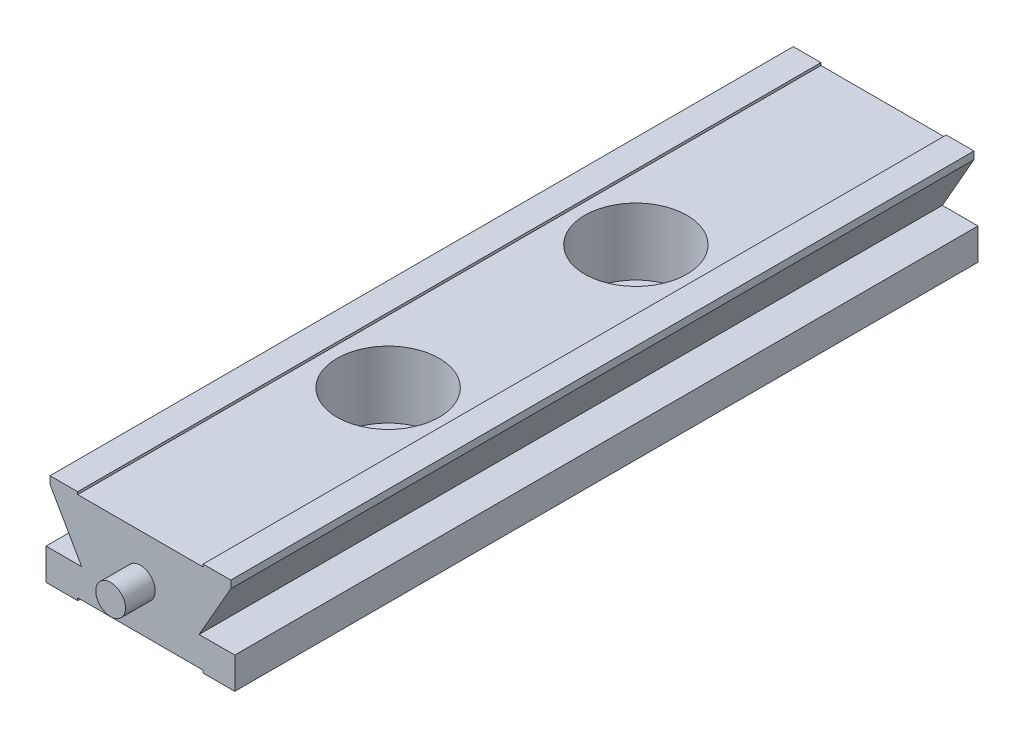
ISO-10303-21;
HEADER;
FILE_DESCRIPTION(('STEP AP214'),'2;1');
FILE_NAME('part.step','',(''),(''),'','','');
FILE_SCHEMA(('AUTOMOTIVE_DESIGN { 1 0 10303 214 1 1 1 1 }'));
ENDSEC;
DATA;
#1=APPLICATION_CONTEXT('core data for automotive mechanical design processes');
#2=APPLICATION_PROTOCOL_DEFINITION('international standard','automotive_design',2000,#1);
#3=PRODUCT_CONTEXT('',#1,'mechanical');
#4=PRODUCT('Part','Part','',(#3));
#5=PRODUCT_RELATED_PRODUCT_CATEGORY('part','',(#4));
#6=PRODUCT_DEFINITION_FORMATION('','',#4);
#7=PRODUCT_DEFINITION_CONTEXT('part definition',#1,'design');
#8=PRODUCT_DEFINITION('design','',#6,#7);
#9=PRODUCT_DEFINITION_SHAPE('','',#8);
#10=(LENGTH_UNIT() NAMED_UNIT(*) SI_UNIT(.MILLI.,.METRE.));
#11=(NAMED_UNIT(*) PLANE_ANGLE_UNIT() SI_UNIT($,.RADIAN.));
#12=(NAMED_UNIT(*) SI_UNIT($,.STERADIAN.) SOLID_ANGLE_UNIT());
#13=UNCERTAINTY_MEASURE_WITH_UNIT(LENGTH_MEASURE(1.E-05),#10,'distance_accuracy_value','');
#14=(GEOMETRIC_REPRESENTATION_CONTEXT(3) GLOBAL_UNCERTAINTY_ASSIGNED_CONTEXT((#13)) GLOBAL_UNIT_ASSIGNED_CONTEXT((#10,
#11,#12)) REPRESENTATION_CONTEXT('',''));
#15=CARTESIAN_POINT('',(0.,0.,0.));
#16=DIRECTION('',(0.,0.,1.));
#17=DIRECTION('',(1.,0.,0.));
#18=AXIS2_PLACEMENT_3D('',#15,#16,#17);
#19=CARTESIAN_POINT('',(-6.3246,9.017,-75.));
#20=DIRECTION('',(0.,1.,0.));
#21=DIRECTION('',(-1.,0.,0.));
#22=AXIS2_PLACEMENT_3D('',#19,#20,#21);
#23=PLANE('',#22);
#24=CARTESIAN_POINT('',(0.,9.01700000000001,-25.));
#25=DIRECTION('',(0.,1.,0.));
#26=DIRECTION('',(-1.,0.,0.));
#27=AXIS2_PLACEMENT_3D('',#24,#25,#26);
#28=CIRCLE('',#27,5.155);
#29=CARTESIAN_POINT('',(-5.155,9.017,-25.));
#30=VERTEX_POINT('',#29);
#31=EDGE_CURVE('E348',#30,#30,#28,.T.);
#32=ORIENTED_EDGE('',*,*,#31,.F.);
#33=EDGE_LOOP('',(#32));
#34=FACE_BOUND('',#33,.T.);
#35=CARTESIAN_POINT('',(0.,9.01700000000001,-50.));
#36=DIRECTION('',(0.,1.,0.));
#37=DIRECTION('',(-1.,0.,0.));
#38=AXIS2_PLACEMENT_3D('',#35,#36,#37);
#39=CIRCLE('',#38,5.155);
#40=CARTESIAN_POINT('',(-5.155,9.017,-50.));
#41=VERTEX_POINT('',#40);
#42=EDGE_CURVE('E352',#41,#41,#39,.T.);
#43=ORIENTED_EDGE('',*,*,#42,.F.);
#44=EDGE_LOOP('',(#43));
#45=FACE_BOUND('',#44,.T.);
#46=DIRECTION('',(-1.,0.,0.));
#47=VECTOR('',#46,1.);
#48=CARTESIAN_POINT('',(-6.3246,9.017,0.));
#49=LINE('',#48,#47);
#50=CARTESIAN_POINT('',(6.32459999999999,9.01700000000001,0.));
#51=VERTEX_POINT('',#50);
#52=CARTESIAN_POINT('',(-6.3246,9.017,0.));
#53=VERTEX_POINT('',#52);
#54=EDGE_CURVE('E205',#51,#53,#49,.T.);
#55=ORIENTED_EDGE('',*,*,#54,.F.);
#56=DIRECTION('',(0.,0.,1.));
#57=VECTOR('',#56,1.);
#58=CARTESIAN_POINT('',(6.32459999999999,9.01700000000001,-75.));
#59=LINE('',#58,#57);
#60=CARTESIAN_POINT('',(6.32459999999999,9.01700000000001,-75.));
#61=VERTEX_POINT('',#60);
#62=EDGE_CURVE('E49',#61,#51,#59,.T.);
#63=ORIENTED_EDGE('',*,*,#62,.F.);
#64=DIRECTION('',(-1.,0.,0.));
#65=VECTOR('',#64,1.);
#66=CARTESIAN_POINT('',(-6.3246,9.017,-75.));
#67=LINE('',#66,#65);
#68=CARTESIAN_POINT('',(-6.3246,9.017,-75.));
#69=VERTEX_POINT('',#68);
#70=EDGE_CURVE('E275',#61,#69,#67,.T.);
#71=ORIENTED_EDGE('',*,*,#70,.T.);
#72=DIRECTION('',(0.,0.,1.));
#73=VECTOR('',#72,1.);
#74=CARTESIAN_POINT('',(-6.3246,9.017,-75.));
#75=LINE('',#74,#73);
#76=EDGE_CURVE('E128',#69,#53,#75,.T.);
#77=ORIENTED_EDGE('',*,*,#76,.T.);
#78=EDGE_LOOP('',(#55,#63,#71,#77));
#79=FACE_BOUND('',#78,.T.);
#80=ADVANCED_FACE('F39',(#34,#45,#79),#23,.T.);
#81=CARTESIAN_POINT('',(6.32459999999999,9.01700000000001,-75.));
#82=DIRECTION('',(-1.,0.,0.));
#83=DIRECTION('',(0.,0.,1.));
#84=AXIS2_PLACEMENT_3D('',#81,#82,#83);
#85=PLANE('',#84);
#86=DIRECTION('',(0.,-1.,0.));
#87=VECTOR('',#86,1.);
#88=CARTESIAN_POINT('',(6.32459999999999,9.01700000000001,0.));
#89=LINE('',#88,#87);
#90=CARTESIAN_POINT('',(6.32459999999999,9.271,0.));
#91=VERTEX_POINT('',#90);
#92=EDGE_CURVE('E271',#91,#51,#89,.T.);
#93=ORIENTED_EDGE('',*,*,#92,.F.);
#94=DIRECTION('',(0.,0.,1.));
#95=VECTOR('',#94,1.);
#96=CARTESIAN_POINT('',(6.32459999999999,9.271,-75.));
#97=LINE('',#96,#95);
#98=CARTESIAN_POINT('',(6.32459999999999,9.271,-75.));
#99=VERTEX_POINT('',#98);
#100=EDGE_CURVE('E116',#99,#91,#97,.T.);
#101=ORIENTED_EDGE('',*,*,#100,.F.);
#102=DIRECTION('',(0.,-1.,0.));
#103=VECTOR('',#102,1.);
#104=CARTESIAN_POINT('',(6.32459999999999,9.01700000000001,-75.));
#105=LINE('',#104,#103);
#106=EDGE_CURVE('E191',#99,#61,#105,.T.);
#107=ORIENTED_EDGE('',*,*,#106,.T.);
#108=ORIENTED_EDGE('',*,*,#62,.T.);
#109=EDGE_LOOP('',(#93,#101,#107,#108));
#110=FACE_BOUND('',#109,.T.);
#111=ADVANCED_FACE('F461',(#110),#85,.T.);
#112=CARTESIAN_POINT('',(6.32459999999999,9.271,-75.));
#113=DIRECTION('',(0.,1.,0.));
#114=DIRECTION('',(-1.,0.,0.));
#115=AXIS2_PLACEMENT_3D('',#112,#113,#114);
#116=PLANE('',#115);
#117=DIRECTION('',(-1.,0.,0.));
#118=VECTOR('',#117,1.);
#119=CARTESIAN_POINT('',(6.32459999999999,9.271,0.));
#120=LINE('',#119,#118);
#121=CARTESIAN_POINT('',(9.1186,9.271,0.));
#122=VERTEX_POINT('',#121);
#123=EDGE_CURVE('E177',#122,#91,#120,.T.);
#124=ORIENTED_EDGE('',*,*,#123,.F.);
#125=DIRECTION('',(0.,0.,1.));
#126=VECTOR('',#125,1.);
#127=CARTESIAN_POINT('',(9.1186,9.271,-75.));
#128=LINE('',#127,#126);
#129=CARTESIAN_POINT('',(9.1186,9.271,-75.));
#130=VERTEX_POINT('',#129);
#131=EDGE_CURVE('E172',#130,#122,#128,.T.);
#132=ORIENTED_EDGE('',*,*,#131,.F.);
#133=DIRECTION('',(-1.,0.,0.));
#134=VECTOR('',#133,1.);
#135=CARTESIAN_POINT('',(6.32459999999999,9.271,-75.));
#136=LINE('',#135,#134);
#137=EDGE_CURVE('E175',#130,#99,#136,.T.);
#138=ORIENTED_EDGE('',*,*,#137,.T.);
#139=ORIENTED_EDGE('',*,*,#100,.T.);
#140=EDGE_LOOP('',(#124,#132,#138,#139));
#141=FACE_BOUND('',#140,.T.);
#142=ADVANCED_FACE('F174',(#141),#116,.T.);
#143=CARTESIAN_POINT('',(9.1186,9.271,-75.));
#144=DIRECTION('',(1.,0.,0.));
#145=DIRECTION('',(0.,0.,-1.));
#146=AXIS2_PLACEMENT_3D('',#143,#144,#145);
#147=PLANE('',#146);
#148=DIRECTION('',(0.,1.,0.));
#149=VECTOR('',#148,1.);
#150=CARTESIAN_POINT('',(9.1186,9.271,0.));
#151=LINE('',#150,#149);
#152=CARTESIAN_POINT('',(9.1186,8.509,0.));
#153=VERTEX_POINT('',#152);
#154=EDGE_CURVE('E266',#153,#122,#151,.T.);
#155=ORIENTED_EDGE('',*,*,#154,.F.);
#156=DIRECTION('',(0.,0.,1.));
#157=VECTOR('',#156,1.);
#158=CARTESIAN_POINT('',(9.1186,8.509,-75.));
#159=LINE('',#158,#157);
#160=CARTESIAN_POINT('',(9.1186,8.509,-75.));
#161=VERTEX_POINT('',#160);
#162=EDGE_CURVE('E183',#161,#153,#159,.T.);
#163=ORIENTED_EDGE('',*,*,#162,.F.);
#164=DIRECTION('',(0.,1.,0.));
#165=VECTOR('',#164,1.);
#166=CARTESIAN_POINT('',(9.1186,9.271,-75.));
#167=LINE('',#166,#165);
#168=EDGE_CURVE('E189',#161,#130,#167,.T.);
#169=ORIENTED_EDGE('',*,*,#168,.T.);
#170=ORIENTED_EDGE('',*,*,#131,.T.);
#171=EDGE_LOOP('',(#155,#163,#169,#170));
#172=FACE_BOUND('',#171,.T.);
#173=ADVANCED_FACE('F194',(#172),#147,.T.);
#174=CARTESIAN_POINT('',(9.1186,8.509,-75.));
#175=DIRECTION('',(0.868289135717219,-0.496058440907365,0.));
#176=DIRECTION('',(0.496058440907365,0.868289135717219,0.));
#177=AXIS2_PLACEMENT_3D('',#174,#175,#176);
#178=PLANE('',#177);
#179=DIRECTION('',(0.496058440907365,0.868289135717219,0.));
#180=VECTOR('',#179,1.);
#181=CARTESIAN_POINT('',(9.1186,8.509,0.));
#182=LINE('',#181,#180);
#183=CARTESIAN_POINT('',(5.92614433775027,2.921,0.));
#184=VERTEX_POINT('',#183);
#185=EDGE_CURVE('E262',#184,#153,#182,.T.);
#186=ORIENTED_EDGE('',*,*,#185,.F.);
#187=DIRECTION('',(0.,0.,1.));
#188=VECTOR('',#187,1.);
#189=CARTESIAN_POINT('',(5.92614433775027,2.921,-75.));
#190=LINE('',#189,#188);
#191=CARTESIAN_POINT('',(5.92614433775027,2.921,-75.));
#192=VERTEX_POINT('',#191);
#193=EDGE_CURVE('E282',#192,#184,#190,.T.);
#194=ORIENTED_EDGE('',*,*,#193,.F.);
#195=DIRECTION('',(0.496058440907365,0.868289135717219,0.));
#196=VECTOR('',#195,1.);
#197=CARTESIAN_POINT('',(9.1186,8.509,-75.));
#198=LINE('',#197,#196);
#199=EDGE_CURVE('E196',#192,#161,#198,.T.);
#200=ORIENTED_EDGE('',*,*,#199,.T.);
#201=ORIENTED_EDGE('',*,*,#162,.T.);
#202=EDGE_LOOP('',(#186,#194,#200,#201));
#203=FACE_BOUND('',#202,.T.);
#204=ADVANCED_FACE('F475',(#203),#178,.T.);
#205=CARTESIAN_POINT('',(5.92614433775027,2.921,-75.));
#206=DIRECTION('',(0.,1.,0.));
#207=DIRECTION('',(0.,0.,1.));
#208=AXIS2_PLACEMENT_3D('',#205,#206,#207);
#209=PLANE('',#208);
#210=DIRECTION('',(-1.,0.,0.));
#211=VECTOR('',#210,1.);
#212=CARTESIAN_POINT('',(5.92614433775027,2.921,0.));
#213=LINE('',#212,#211);
#214=CARTESIAN_POINT('',(9.525,2.921,0.));
#215=VERTEX_POINT('',#214);
#216=EDGE_CURVE('E258',#215,#184,#213,.T.);
#217=ORIENTED_EDGE('',*,*,#216,.F.);
#218=DIRECTION('',(0.,0.,1.));
#219=VECTOR('',#218,1.);
#220=CARTESIAN_POINT('',(9.525,2.921,-75.));
#221=LINE('',#220,#219);
#222=CARTESIAN_POINT('',(9.525,2.921,-75.));
#223=VERTEX_POINT('',#222);
#224=EDGE_CURVE('E285',#223,#215,#221,.T.);
#225=ORIENTED_EDGE('',*,*,#224,.F.);
#226=DIRECTION('',(-1.,0.,0.));
#227=VECTOR('',#226,1.);
#228=CARTESIAN_POINT('',(5.92614433775027,2.921,-75.));
#229=LINE('',#228,#227);
#230=EDGE_CURVE('E199',#223,#192,#229,.T.);
#231=ORIENTED_EDGE('',*,*,#230,.T.);
#232=ORIENTED_EDGE('',*,*,#193,.T.);
#233=EDGE_LOOP('',(#217,#225,#231,#232));
#234=FACE_BOUND('',#233,.T.);
#235=ADVANCED_FACE('F412',(#234),#209,.T.);
#236=CARTESIAN_POINT('',(9.525,2.921,-75.));
#237=DIRECTION('',(1.,0.,0.));
#238=DIRECTION('',(0.,0.,-1.));
#239=AXIS2_PLACEMENT_3D('',#236,#237,#238);
#240=PLANE('',#239);
#241=DIRECTION('',(0.,1.,0.));
#242=VECTOR('',#241,1.);
#243=CARTESIAN_POINT('',(9.525,2.921,0.));
#244=LINE('',#243,#242);
#245=CARTESIAN_POINT('',(9.525,-0.253999999999995,0.));
#246=VERTEX_POINT('',#245);
#247=EDGE_CURVE('E254',#246,#215,#244,.T.);
#248=ORIENTED_EDGE('',*,*,#247,.F.);
#249=DIRECTION('',(0.,0.,1.));
#250=VECTOR('',#249,1.);
#251=CARTESIAN_POINT('',(9.525,-0.253999999999995,-75.));
#252=LINE('',#251,#250);
#253=CARTESIAN_POINT('',(9.525,-0.253999999999995,-75.));
#254=VERTEX_POINT('',#253);
#255=EDGE_CURVE('E288',#254,#246,#252,.T.);
#256=ORIENTED_EDGE('',*,*,#255,.F.);
#257=DIRECTION('',(0.,1.,0.));
#258=VECTOR('',#257,1.);
#259=CARTESIAN_POINT('',(9.525,2.921,-75.));
#260=LINE('',#259,#258);
#261=EDGE_CURVE('E404',#254,#223,#260,.T.);
#262=ORIENTED_EDGE('',*,*,#261,.T.);
#263=ORIENTED_EDGE('',*,*,#224,.T.);
#264=EDGE_LOOP('',(#248,#256,#262,#263));
#265=FACE_BOUND('',#264,.T.);
#266=ADVANCED_FACE('F418',(#265),#240,.T.);
#267=CARTESIAN_POINT('',(9.525,-0.253999999999995,-75.));
#268=DIRECTION('',(0.,-1.,0.));
#269=DIRECTION('',(1.,0.,0.));
#270=AXIS2_PLACEMENT_3D('',#267,#268,#269);
#271=PLANE('',#270);
#272=DIRECTION('',(1.,0.,0.));
#273=VECTOR('',#272,1.);
#274=CARTESIAN_POINT('',(9.525,-0.253999999999995,0.));
#275=LINE('',#274,#273);
#276=CARTESIAN_POINT('',(6.3246,-0.253999999999993,0.));
#277=VERTEX_POINT('',#276);
#278=EDGE_CURVE('E250',#277,#246,#275,.T.);
#279=ORIENTED_EDGE('',*,*,#278,.F.);
#280=DIRECTION('',(0.,0.,1.));
#281=VECTOR('',#280,1.);
#282=CARTESIAN_POINT('',(6.3246,-0.253999999999993,-75.));
#283=LINE('',#282,#281);
#284=CARTESIAN_POINT('',(6.3246,-0.253999999999993,-75.));
#285=VERTEX_POINT('',#284);
#286=EDGE_CURVE('E291',#285,#277,#283,.T.);
#287=ORIENTED_EDGE('',*,*,#286,.F.);
#288=DIRECTION('',(1.,0.,0.));
#289=VECTOR('',#288,1.);
#290=CARTESIAN_POINT('',(9.525,-0.253999999999995,-75.));
#291=LINE('',#290,#289);
#292=EDGE_CURVE('E400',#285,#254,#291,.T.);
#293=ORIENTED_EDGE('',*,*,#292,.T.);
#294=ORIENTED_EDGE('',*,*,#255,.T.);
#295=EDGE_LOOP('',(#279,#287,#293,#294));
#296=FACE_BOUND('',#295,.T.);
#297=ADVANCED_FACE('F421',(#296),#271,.T.);
#298=CARTESIAN_POINT('',(6.3246,-0.253999999999993,-75.));
#299=DIRECTION('',(-1.,0.,0.));
#300=DIRECTION('',(0.,0.,1.));
#301=AXIS2_PLACEMENT_3D('',#298,#299,#300);
#302=PLANE('',#301);
#303=DIRECTION('',(0.,-1.,0.));
#304=VECTOR('',#303,1.);
#305=CARTESIAN_POINT('',(6.3246,-0.253999999999993,0.));
#306=LINE('',#305,#304);
#307=CARTESIAN_POINT('',(6.3246,0.,0.));
#308=VERTEX_POINT('',#307);
#309=EDGE_CURVE('E246',#308,#277,#306,.T.);
#310=ORIENTED_EDGE('',*,*,#309,.F.);
#311=DIRECTION('',(0.,0.,1.));
#312=VECTOR('',#311,1.);
#313=CARTESIAN_POINT('',(6.3246,0.,-75.));
#314=LINE('',#313,#312);
#315=CARTESIAN_POINT('',(6.3246,0.,-75.));
#316=VERTEX_POINT('',#315);
#317=EDGE_CURVE('E294',#316,#308,#314,.T.);
#318=ORIENTED_EDGE('',*,*,#317,.F.);
#319=DIRECTION('',(0.,-1.,0.));
#320=VECTOR('',#319,1.);
#321=CARTESIAN_POINT('',(6.3246,-0.253999999999993,-75.));
#322=LINE('',#321,#320);
#323=EDGE_CURVE('E396',#316,#285,#322,.T.);
#324=ORIENTED_EDGE('',*,*,#323,.T.);
#325=ORIENTED_EDGE('',*,*,#286,.T.);
#326=EDGE_LOOP('',(#310,#318,#324,#325));
#327=FACE_BOUND('',#326,.T.);
#328=ADVANCED_FACE('F426',(#327),#302,.T.);
#329=CARTESIAN_POINT('',(6.3246,0.,-75.));
#330=DIRECTION('',(0.,-1.,0.));
#331=DIRECTION('',(1.,0.,0.));
#332=AXIS2_PLACEMENT_3D('',#329,#330,#331);
#333=PLANE('',#332);
#334=CARTESIAN_POINT('',(0.,0.,-50.));
#335=DIRECTION('',(0.,-1.,0.));
#336=DIRECTION('',(1.,0.,0.));
#337=AXIS2_PLACEMENT_3D('',#334,#335,#336);
#338=CIRCLE('',#337,3.365);
#339=CARTESIAN_POINT('',(3.365,0.,-50.));
#340=VERTEX_POINT('',#339);
#341=EDGE_CURVE('E325',#340,#340,#338,.T.);
#342=ORIENTED_EDGE('',*,*,#341,.F.);
#343=EDGE_LOOP('',(#342));
#344=FACE_BOUND('',#343,.T.);
#345=CARTESIAN_POINT('',(0.,0.,-25.));
#346=DIRECTION('',(0.,-1.,0.));
#347=DIRECTION('',(1.,0.,0.));
#348=AXIS2_PLACEMENT_3D('',#345,#346,#347);
#349=CIRCLE('',#348,3.365);
#350=CARTESIAN_POINT('',(3.365,0.,-25.));
#351=VERTEX_POINT('',#350);
#352=EDGE_CURVE('E333',#351,#351,#349,.T.);
#353=ORIENTED_EDGE('',*,*,#352,.F.);
#354=EDGE_LOOP('',(#353));
#355=FACE_BOUND('',#354,.T.);
#356=DIRECTION('',(1.,0.,0.));
#357=VECTOR('',#356,1.);
#358=CARTESIAN_POINT('',(6.3246,0.,0.));
#359=LINE('',#358,#357);
#360=CARTESIAN_POINT('',(-6.3246,0.,0.));
#361=VERTEX_POINT('',#360);
#362=EDGE_CURVE('E242',#361,#308,#359,.T.);
#363=ORIENTED_EDGE('',*,*,#362,.F.);
#364=DIRECTION('',(0.,0.,1.));
#365=VECTOR('',#364,1.);
#366=CARTESIAN_POINT('',(-6.3246,0.,-75.));
#367=LINE('',#366,#365);
#368=CARTESIAN_POINT('',(-6.3246,0.,-75.));
#369=VERTEX_POINT('',#368);
#370=EDGE_CURVE('E297',#369,#361,#367,.T.);
#371=ORIENTED_EDGE('',*,*,#370,.F.);
#372=DIRECTION('',(1.,0.,0.));
#373=VECTOR('',#372,1.);
#374=CARTESIAN_POINT('',(6.3246,0.,-75.));
#375=LINE('',#374,#373);
#376=EDGE_CURVE('E392',#369,#316,#375,.T.);
#377=ORIENTED_EDGE('',*,*,#376,.T.);
#378=ORIENTED_EDGE('',*,*,#317,.T.);
#379=EDGE_LOOP('',(#363,#371,#377,#378));
#380=FACE_BOUND('',#379,.T.);
#381=ADVANCED_FACE('F429',(#344,#355,#380),#333,.T.);
#382=CARTESIAN_POINT('',(-6.3246,0.,-75.));
#383=DIRECTION('',(1.,0.,0.));
#384=DIRECTION('',(0.,0.,-1.));
#385=AXIS2_PLACEMENT_3D('',#382,#383,#384);
#386=PLANE('',#385);
#387=DIRECTION('',(0.,1.,0.));
#388=VECTOR('',#387,1.);
#389=CARTESIAN_POINT('',(-6.3246,0.,0.));
#390=LINE('',#389,#388);
#391=CARTESIAN_POINT('',(-6.3246,-0.253999999999997,0.));
#392=VERTEX_POINT('',#391);
#393=EDGE_CURVE('E238',#392,#361,#390,.T.);
#394=ORIENTED_EDGE('',*,*,#393,.F.);
#395=DIRECTION('',(0.,0.,1.));
#396=VECTOR('',#395,1.);
#397=CARTESIAN_POINT('',(-6.3246,-0.253999999999997,-75.));
#398=LINE('',#397,#396);
#399=CARTESIAN_POINT('',(-6.3246,-0.253999999999997,-75.));
#400=VERTEX_POINT('',#399);
#401=EDGE_CURVE('E300',#400,#392,#398,.T.);
#402=ORIENTED_EDGE('',*,*,#401,.F.);
#403=DIRECTION('',(0.,1.,0.));
#404=VECTOR('',#403,1.);
#405=CARTESIAN_POINT('',(-6.3246,0.,-75.));
#406=LINE('',#405,#404);
#407=EDGE_CURVE('E388',#400,#369,#406,.T.);
#408=ORIENTED_EDGE('',*,*,#407,.T.);
#409=ORIENTED_EDGE('',*,*,#370,.T.);
#410=EDGE_LOOP('',(#394,#402,#408,#409));
#411=FACE_BOUND('',#410,.T.);
#412=ADVANCED_FACE('F434',(#411),#386,.T.);
#413=CARTESIAN_POINT('',(-6.3246,-0.253999999999997,-75.));
#414=DIRECTION('',(0.,-1.,0.));
#415=DIRECTION('',(1.,0.,0.));
#416=AXIS2_PLACEMENT_3D('',#413,#414,#415);
#417=PLANE('',#416);
#418=DIRECTION('',(1.,0.,0.));
#419=VECTOR('',#418,1.);
#420=CARTESIAN_POINT('',(-6.3246,-0.253999999999997,0.));
#421=LINE('',#420,#419);
#422=CARTESIAN_POINT('',(-9.525,-0.253999999999997,0.));
#423=VERTEX_POINT('',#422);
#424=EDGE_CURVE('E234',#423,#392,#421,.T.);
#425=ORIENTED_EDGE('',*,*,#424,.F.);
#426=DIRECTION('',(0.,0.,1.));
#427=VECTOR('',#426,1.);
#428=CARTESIAN_POINT('',(-9.525,-0.253999999999997,-75.));
#429=LINE('',#428,#427);
#430=CARTESIAN_POINT('',(-9.525,-0.253999999999997,-75.));
#431=VERTEX_POINT('',#430);
#432=EDGE_CURVE('E303',#431,#423,#429,.T.);
#433=ORIENTED_EDGE('',*,*,#432,.F.);
#434=DIRECTION('',(1.,0.,0.));
#435=VECTOR('',#434,1.);
#436=CARTESIAN_POINT('',(-6.3246,-0.253999999999997,-75.));
#437=LINE('',#436,#435);
#438=EDGE_CURVE('E384',#431,#400,#437,.T.);
#439=ORIENTED_EDGE('',*,*,#438,.T.);
#440=ORIENTED_EDGE('',*,*,#401,.T.);
#441=EDGE_LOOP('',(#425,#433,#439,#440));
#442=FACE_BOUND('',#441,.T.);
#443=ADVANCED_FACE('F437',(#442),#417,.T.);
#444=CARTESIAN_POINT('',(-9.525,-0.253999999999997,-75.));
#445=DIRECTION('',(-1.,0.,0.));
#446=DIRECTION('',(0.,0.,1.));
#447=AXIS2_PLACEMENT_3D('',#444,#445,#446);
#448=PLANE('',#447);
#449=DIRECTION('',(0.,-1.,0.));
#450=VECTOR('',#449,1.);
#451=CARTESIAN_POINT('',(-9.525,-0.253999999999997,0.));
#452=LINE('',#451,#450);
#453=CARTESIAN_POINT('',(-9.525,2.921,0.));
#454=VERTEX_POINT('',#453);
#455=EDGE_CURVE('E230',#454,#423,#452,.T.);
#456=ORIENTED_EDGE('',*,*,#455,.F.);
#457=DIRECTION('',(0.,0.,1.));
#458=VECTOR('',#457,1.);
#459=CARTESIAN_POINT('',(-9.525,2.921,-75.));
#460=LINE('',#459,#458);
#461=CARTESIAN_POINT('',(-9.525,2.921,-75.));
#462=VERTEX_POINT('',#461);
#463=EDGE_CURVE('E306',#462,#454,#460,.T.);
#464=ORIENTED_EDGE('',*,*,#463,.F.);
#465=DIRECTION('',(0.,-1.,0.));
#466=VECTOR('',#465,1.);
#467=CARTESIAN_POINT('',(-9.525,-0.253999999999997,-75.));
#468=LINE('',#467,#466);
#469=EDGE_CURVE('E380',#462,#431,#468,.T.);
#470=ORIENTED_EDGE('',*,*,#469,.T.);
#471=ORIENTED_EDGE('',*,*,#432,.T.);
#472=EDGE_LOOP('',(#456,#464,#470,#471));
#473=FACE_BOUND('',#472,.T.);
#474=ADVANCED_FACE('F442',(#473),#448,.T.);
#475=CARTESIAN_POINT('',(-9.525,2.921,-75.));
#476=DIRECTION('',(0.,1.,0.));
#477=DIRECTION('',(0.,0.,1.));
#478=AXIS2_PLACEMENT_3D('',#475,#476,#477);
#479=PLANE('',#478);
#480=DIRECTION('',(-1.,0.,0.));
#481=VECTOR('',#480,1.);
#482=CARTESIAN_POINT('',(-9.525,2.921,0.));
#483=LINE('',#482,#481);
#484=CARTESIAN_POINT('',(-5.92614433775027,2.921,0.));
#485=VERTEX_POINT('',#484);
#486=EDGE_CURVE('E226',#485,#454,#483,.T.);
#487=ORIENTED_EDGE('',*,*,#486,.F.);
#488=DIRECTION('',(0.,0.,1.));
#489=VECTOR('',#488,1.);
#490=CARTESIAN_POINT('',(-5.92614433775027,2.921,-75.));
#491=LINE('',#490,#489);
#492=CARTESIAN_POINT('',(-5.92614433775027,2.921,-75.));
#493=VERTEX_POINT('',#492);
#494=EDGE_CURVE('E309',#493,#485,#491,.T.);
#495=ORIENTED_EDGE('',*,*,#494,.F.);
#496=DIRECTION('',(-1.,0.,0.));
#497=VECTOR('',#496,1.);
#498=CARTESIAN_POINT('',(-9.525,2.921,-75.));
#499=LINE('',#498,#497);
#500=EDGE_CURVE('E376',#493,#462,#499,.T.);
#501=ORIENTED_EDGE('',*,*,#500,.T.);
#502=ORIENTED_EDGE('',*,*,#463,.T.);
#503=EDGE_LOOP('',(#487,#495,#501,#502));
#504=FACE_BOUND('',#503,.T.);
#505=ADVANCED_FACE('F445',(#504),#479,.T.);
#506=CARTESIAN_POINT('',(-5.92614433775027,2.921,-75.));
#507=DIRECTION('',(-0.868289135717219,-0.496058440907365,0.));
#508=DIRECTION('',(0.496058440907365,-0.868289135717219,0.));
#509=AXIS2_PLACEMENT_3D('',#506,#507,#508);
#510=PLANE('',#509);
#511=DIRECTION('',(0.496058440907365,-0.868289135717219,0.));
#512=VECTOR('',#511,1.);
#513=CARTESIAN_POINT('',(-5.92614433775027,2.921,0.));
#514=LINE('',#513,#512);
#515=CARTESIAN_POINT('',(-9.1186,8.509,0.));
#516=VERTEX_POINT('',#515);
#517=EDGE_CURVE('E222',#516,#485,#514,.T.);
#518=ORIENTED_EDGE('',*,*,#517,.F.);
#519=DIRECTION('',(0.,0.,1.));
#520=VECTOR('',#519,1.);
#521=CARTESIAN_POINT('',(-9.1186,8.509,-75.));
#522=LINE('',#521,#520);
#523=CARTESIAN_POINT('',(-9.1186,8.509,-75.));
#524=VERTEX_POINT('',#523);
#525=EDGE_CURVE('E312',#524,#516,#522,.T.);
#526=ORIENTED_EDGE('',*,*,#525,.F.);
#527=DIRECTION('',(0.496058440907365,-0.868289135717219,0.));
#528=VECTOR('',#527,1.);
#529=CARTESIAN_POINT('',(-5.92614433775027,2.921,-75.));
#530=LINE('',#529,#528);
#531=EDGE_CURVE('E372',#524,#493,#530,.T.);
#532=ORIENTED_EDGE('',*,*,#531,.T.);
#533=ORIENTED_EDGE('',*,*,#494,.T.);
#534=EDGE_LOOP('',(#518,#526,#532,#533));
#535=FACE_BOUND('',#534,.T.);
#536=ADVANCED_FACE('F450',(#535),#510,.T.);
#537=CARTESIAN_POINT('',(-9.1186,8.509,-75.));
#538=DIRECTION('',(-1.,0.,0.));
#539=DIRECTION('',(0.,0.,1.));
#540=AXIS2_PLACEMENT_3D('',#537,#538,#539);
#541=PLANE('',#540);
#542=DIRECTION('',(0.,-1.,0.));
#543=VECTOR('',#542,1.);
#544=CARTESIAN_POINT('',(-9.1186,8.509,0.));
#545=LINE('',#544,#543);
#546=CARTESIAN_POINT('',(-9.1186,9.271,0.));
#547=VERTEX_POINT('',#546);
#548=EDGE_CURVE('E218',#547,#516,#545,.T.);
#549=ORIENTED_EDGE('',*,*,#548,.F.);
#550=DIRECTION('',(0.,0.,1.));
#551=VECTOR('',#550,1.);
#552=CARTESIAN_POINT('',(-9.1186,9.271,-75.));
#553=LINE('',#552,#551);
#554=CARTESIAN_POINT('',(-9.1186,9.271,-75.));
#555=VERTEX_POINT('',#554);
#556=EDGE_CURVE('E315',#555,#547,#553,.T.);
#557=ORIENTED_EDGE('',*,*,#556,.F.);
#558=DIRECTION('',(0.,-1.,0.));
#559=VECTOR('',#558,1.);
#560=CARTESIAN_POINT('',(-9.1186,8.509,-75.));
#561=LINE('',#560,#559);
#562=EDGE_CURVE('E368',#555,#524,#561,.T.);
#563=ORIENTED_EDGE('',*,*,#562,.T.);
#564=ORIENTED_EDGE('',*,*,#525,.T.);
#565=EDGE_LOOP('',(#549,#557,#563,#564));
#566=FACE_BOUND('',#565,.T.);
#567=ADVANCED_FACE('F453',(#566),#541,.T.);
#568=CARTESIAN_POINT('',(-9.1186,9.271,-75.));
#569=DIRECTION('',(0.,1.,0.));
#570=DIRECTION('',(0.,0.,1.));
#571=AXIS2_PLACEMENT_3D('',#568,#569,#570);
#572=PLANE('',#571);
#573=DIRECTION('',(-1.,0.,0.));
#574=VECTOR('',#573,1.);
#575=CARTESIAN_POINT('',(-9.1186,9.271,0.));
#576=LINE('',#575,#574);
#577=CARTESIAN_POINT('',(-6.3246,9.271,0.));
#578=VERTEX_POINT('',#577);
#579=EDGE_CURVE('E214',#578,#547,#576,.T.);
#580=ORIENTED_EDGE('',*,*,#579,.F.);
#581=DIRECTION('',(0.,0.,1.));
#582=VECTOR('',#581,1.);
#583=CARTESIAN_POINT('',(-6.3246,9.271,-75.));
#584=LINE('',#583,#582);
#585=CARTESIAN_POINT('',(-6.3246,9.271,-75.));
#586=VERTEX_POINT('',#585);
#587=EDGE_CURVE('E318',#586,#578,#584,.T.);
#588=ORIENTED_EDGE('',*,*,#587,.F.);
#589=DIRECTION('',(-1.,0.,0.));
#590=VECTOR('',#589,1.);
#591=CARTESIAN_POINT('',(-9.1186,9.271,-75.));
#592=LINE('',#591,#590);
#593=EDGE_CURVE('E364',#586,#555,#592,.T.);
#594=ORIENTED_EDGE('',*,*,#593,.T.);
#595=ORIENTED_EDGE('',*,*,#556,.T.);
#596=EDGE_LOOP('',(#580,#588,#594,#595));
#597=FACE_BOUND('',#596,.T.);
#598=ADVANCED_FACE('F457',(#597),#572,.T.);
#599=CARTESIAN_POINT('',(-6.3246,9.271,-75.));
#600=DIRECTION('',(1.,0.,0.));
#601=DIRECTION('',(0.,0.,-1.));
#602=AXIS2_PLACEMENT_3D('',#599,#600,#601);
#603=PLANE('',#602);
#604=DIRECTION('',(0.,1.,0.));
#605=VECTOR('',#604,1.);
#606=CARTESIAN_POINT('',(-6.3246,9.271,0.));
#607=LINE('',#606,#605);
#608=EDGE_CURVE('E209',#53,#578,#607,.T.);
#609=ORIENTED_EDGE('',*,*,#608,.F.);
#610=ORIENTED_EDGE('',*,*,#76,.F.);
#611=DIRECTION('',(0.,1.,0.));
#612=VECTOR('',#611,1.);
#613=CARTESIAN_POINT('',(-6.3246,9.271,-75.));
#614=LINE('',#613,#612);
#615=EDGE_CURVE('E361',#69,#586,#614,.T.);
#616=ORIENTED_EDGE('',*,*,#615,.T.);
#617=ORIENTED_EDGE('',*,*,#587,.T.);
#618=EDGE_LOOP('',(#609,#610,#616,#617));
#619=FACE_BOUND('',#618,.T.);
#620=ADVANCED_FACE('F458',(#619),#603,.T.);
#621=CARTESIAN_POINT('',(0.,0.,-75.));
#622=DIRECTION('',(0.,0.,1.));
#623=DIRECTION('',(1.,0.,0.));
#624=AXIS2_PLACEMENT_3D('',#621,#622,#623);
#625=PLANE('',#624);
#626=CARTESIAN_POINT('',(0.,4.5085,-75.));
#627=DIRECTION('',(0.,0.,-1.));
#628=DIRECTION('',(-1.,0.,0.));
#629=AXIS2_PLACEMENT_3D('',#626,#627,#628);
#630=CIRCLE('',#629,1.5);
#631=CARTESIAN_POINT('',(-1.5,4.5085,-75.));
#632=VERTEX_POINT('',#631);
#633=EDGE_CURVE('E342',#632,#632,#630,.T.);
#634=ORIENTED_EDGE('',*,*,#633,.F.);
#635=EDGE_LOOP('',(#634));
#636=FACE_BOUND('',#635,.T.);
#637=ORIENTED_EDGE('',*,*,#70,.F.);
#638=ORIENTED_EDGE('',*,*,#106,.F.);
#639=ORIENTED_EDGE('',*,*,#137,.F.);
#640=ORIENTED_EDGE('',*,*,#168,.F.);
#641=ORIENTED_EDGE('',*,*,#199,.F.);
#642=ORIENTED_EDGE('',*,*,#230,.F.);
#643=ORIENTED_EDGE('',*,*,#261,.F.);
#644=ORIENTED_EDGE('',*,*,#292,.F.);
#645=ORIENTED_EDGE('',*,*,#323,.F.);
#646=ORIENTED_EDGE('',*,*,#376,.F.);
#647=ORIENTED_EDGE('',*,*,#407,.F.);
#648=ORIENTED_EDGE('',*,*,#438,.F.);
#649=ORIENTED_EDGE('',*,*,#469,.F.);
#650=ORIENTED_EDGE('',*,*,#500,.F.);
#651=ORIENTED_EDGE('',*,*,#531,.F.);
#652=ORIENTED_EDGE('',*,*,#562,.F.);
#653=ORIENTED_EDGE('',*,*,#593,.F.);
#654=ORIENTED_EDGE('',*,*,#615,.F.);
#655=EDGE_LOOP('',(#637,#638,#639,#640,#641,#642,#643,#644,#645,#646,#647,#648,#649,#650,#651,
#652,#653,#654));
#656=FACE_BOUND('',#655,.T.);
#657=ADVANCED_FACE('F187',(#636,#656),#625,.F.);
#658=CARTESIAN_POINT('',(0.,0.,0.));
#659=DIRECTION('',(0.,0.,1.));
#660=DIRECTION('',(1.,0.,0.));
#661=AXIS2_PLACEMENT_3D('',#658,#659,#660);
#662=PLANE('',#661);
#663=CARTESIAN_POINT('',(0.,4.5085,0.));
#664=DIRECTION('',(0.,0.,1.));
#665=DIRECTION('',(1.,0.,0.));
#666=AXIS2_PLACEMENT_3D('',#663,#664,#665);
#667=CIRCLE('',#666,1.5);
#668=CARTESIAN_POINT('',(1.5,4.5085,0.));
#669=VERTEX_POINT('',#668);
#670=EDGE_CURVE('E11',#669,#669,#667,.T.);
#671=ORIENTED_EDGE('',*,*,#670,.F.);
#672=EDGE_LOOP('',(#671));
#673=FACE_BOUND('',#672,.T.);
#674=ORIENTED_EDGE('',*,*,#54,.T.);
#675=ORIENTED_EDGE('',*,*,#608,.T.);
#676=ORIENTED_EDGE('',*,*,#579,.T.);
#677=ORIENTED_EDGE('',*,*,#548,.T.);
#678=ORIENTED_EDGE('',*,*,#517,.T.);
#679=ORIENTED_EDGE('',*,*,#486,.T.);
#680=ORIENTED_EDGE('',*,*,#455,.T.);
#681=ORIENTED_EDGE('',*,*,#424,.T.);
#682=ORIENTED_EDGE('',*,*,#393,.T.);
#683=ORIENTED_EDGE('',*,*,#362,.T.);
#684=ORIENTED_EDGE('',*,*,#309,.T.);
#685=ORIENTED_EDGE('',*,*,#278,.T.);
#686=ORIENTED_EDGE('',*,*,#247,.T.);
#687=ORIENTED_EDGE('',*,*,#216,.T.);
#688=ORIENTED_EDGE('',*,*,#185,.T.);
#689=ORIENTED_EDGE('',*,*,#154,.T.);
#690=ORIENTED_EDGE('',*,*,#123,.T.);
#691=ORIENTED_EDGE('',*,*,#92,.T.);
#692=EDGE_LOOP('',(#674,#675,#676,#677,#678,#679,#680,#681,#682,#683,#684,#685,#686,#687,#688,
#689,#690,#691));
#693=FACE_BOUND('',#692,.T.);
#694=ADVANCED_FACE('F460',(#673,#693),#662,.T.);
#695=CARTESIAN_POINT('',(0.,2.28700000000001,-50.));
#696=DIRECTION('',(0.,1.,0.));
#697=DIRECTION('',(-1.,0.,0.));
#698=AXIS2_PLACEMENT_3D('',#695,#696,#697);
#699=CYLINDRICAL_SURFACE('',#698,5.155);
#700=CARTESIAN_POINT('',(0.,2.28700000000001,-50.));
#701=DIRECTION('',(0.,1.,0.));
#702=DIRECTION('',(-1.,0.,0.));
#703=AXIS2_PLACEMENT_3D('',#700,#701,#702);
#704=CIRCLE('',#703,5.155);
#705=CARTESIAN_POINT('',(-5.155,2.287,-50.));
#706=VERTEX_POINT('',#705);
#707=EDGE_CURVE('E331',#706,#706,#704,.T.);
#708=ORIENTED_EDGE('',*,*,#707,.F.);
#709=EDGE_LOOP('',(#708));
#710=FACE_BOUND('',#709,.T.);
#711=ORIENTED_EDGE('',*,*,#42,.T.);
#712=EDGE_LOOP('',(#711));
#713=FACE_BOUND('',#712,.T.);
#714=ADVANCED_FACE('F511',(#710,#713),#699,.F.);
#715=CARTESIAN_POINT('',(0.,2.28700000000001,-50.));
#716=DIRECTION('',(0.,1.,0.));
#717=DIRECTION('',(-1.,0.,0.));
#718=AXIS2_PLACEMENT_3D('',#715,#716,#717);
#719=PLANE('',#718);
#720=CARTESIAN_POINT('',(0.,2.28700000000001,-50.));
#721=DIRECTION('',(0.,1.,0.));
#722=DIRECTION('',(-1.,0.,0.));
#723=AXIS2_PLACEMENT_3D('',#720,#721,#722);
#724=CIRCLE('',#723,3.365);
#725=CARTESIAN_POINT('',(-3.365,2.287,-50.));
#726=VERTEX_POINT('',#725);
#727=EDGE_CURVE('E42',#726,#726,#724,.T.);
#728=ORIENTED_EDGE('',*,*,#727,.F.);
#729=EDGE_LOOP('',(#728));
#730=FACE_BOUND('',#729,.T.);
#731=ORIENTED_EDGE('',*,*,#707,.T.);
#732=EDGE_LOOP('',(#731));
#733=FACE_BOUND('',#732,.T.);
#734=ADVANCED_FACE('F515',(#730,#733),#719,.T.);
#735=CARTESIAN_POINT('',(0.,2.28700000000001,-25.));
#736=DIRECTION('',(0.,1.,0.));
#737=DIRECTION('',(-1.,0.,0.));
#738=AXIS2_PLACEMENT_3D('',#735,#736,#737);
#739=CYLINDRICAL_SURFACE('',#738,5.155);
#740=CARTESIAN_POINT('',(0.,2.28700000000001,-25.));
#741=DIRECTION('',(0.,1.,0.));
#742=DIRECTION('',(-1.,0.,0.));
#743=AXIS2_PLACEMENT_3D('',#740,#741,#742);
#744=CIRCLE('',#743,5.155);
#745=CARTESIAN_POINT('',(-5.15499999999999,2.287,-25.));
#746=VERTEX_POINT('',#745);
#747=EDGE_CURVE('E210',#746,#746,#744,.T.);
#748=ORIENTED_EDGE('',*,*,#747,.F.);
#749=EDGE_LOOP('',(#748));
#750=FACE_BOUND('',#749,.T.);
#751=ORIENTED_EDGE('',*,*,#31,.T.);
#752=EDGE_LOOP('',(#751));
#753=FACE_BOUND('',#752,.T.);
#754=ADVANCED_FACE('F518',(#750,#753),#739,.F.);
#755=CARTESIAN_POINT('',(0.,2.28700000000001,-25.));
#756=DIRECTION('',(0.,1.,0.));
#757=DIRECTION('',(-1.,0.,0.));
#758=AXIS2_PLACEMENT_3D('',#755,#756,#757);
#759=PLANE('',#758);
#760=CARTESIAN_POINT('',(0.,2.28700000000001,-25.));
#761=DIRECTION('',(0.,1.,0.));
#762=DIRECTION('',(-1.,0.,0.));
#763=AXIS2_PLACEMENT_3D('',#760,#761,#762);
#764=CIRCLE('',#763,3.365);
#765=CARTESIAN_POINT('',(-3.365,2.287,-25.));
#766=VERTEX_POINT('',#765);
#767=EDGE_CURVE('E322',#766,#766,#764,.T.);
#768=ORIENTED_EDGE('',*,*,#767,.F.);
#769=EDGE_LOOP('',(#768));
#770=FACE_BOUND('',#769,.T.);
#771=ORIENTED_EDGE('',*,*,#747,.T.);
#772=EDGE_LOOP('',(#771));
#773=FACE_BOUND('',#772,.T.);
#774=ADVANCED_FACE('F525',(#770,#773),#759,.T.);
#775=CARTESIAN_POINT('',(0.,2.54,-25.));
#776=DIRECTION('',(0.,-1.,0.));
#777=DIRECTION('',(1.,0.,0.));
#778=AXIS2_PLACEMENT_3D('',#775,#776,#777);
#779=CYLINDRICAL_SURFACE('',#778,3.365);
#780=ORIENTED_EDGE('',*,*,#767,.T.);
#781=EDGE_LOOP('',(#780));
#782=FACE_BOUND('',#781,.T.);
#783=ORIENTED_EDGE('',*,*,#352,.T.);
#784=EDGE_LOOP('',(#783));
#785=FACE_BOUND('',#784,.T.);
#786=ADVANCED_FACE('F529',(#782,#785),#779,.F.);
#787=CARTESIAN_POINT('',(0.,2.54,-50.));
#788=DIRECTION('',(0.,-1.,0.));
#789=DIRECTION('',(1.,0.,0.));
#790=AXIS2_PLACEMENT_3D('',#787,#788,#789);
#791=CYLINDRICAL_SURFACE('',#790,3.365);
#792=ORIENTED_EDGE('',*,*,#727,.T.);
#793=EDGE_LOOP('',(#792));
#794=FACE_BOUND('',#793,.T.);
#795=ORIENTED_EDGE('',*,*,#341,.T.);
#796=EDGE_LOOP('',(#795));
#797=FACE_BOUND('',#796,.T.);
#798=ADVANCED_FACE('F533',(#794,#797),#791,.F.);
#799=CARTESIAN_POINT('',(0.,4.5085,-72.));
#800=DIRECTION('',(0.,0.,-1.));
#801=DIRECTION('',(-1.,0.,0.));
#802=AXIS2_PLACEMENT_3D('',#799,#800,#801);
#803=CYLINDRICAL_SURFACE('',#802,1.5);
#804=CARTESIAN_POINT('',(0.,4.5085,-72.));
#805=DIRECTION('',(0.,0.,-1.));
#806=DIRECTION('',(-1.,0.,0.));
#807=AXIS2_PLACEMENT_3D('',#804,#805,#806);
#808=CIRCLE('',#807,1.5);
#809=CARTESIAN_POINT('',(-1.5,4.5085,-72.));
#810=VERTEX_POINT('',#809);
#811=EDGE_CURVE('E339',#810,#810,#808,.T.);
#812=ORIENTED_EDGE('',*,*,#811,.F.);
#813=EDGE_LOOP('',(#812));
#814=FACE_BOUND('',#813,.T.);
#815=ORIENTED_EDGE('',*,*,#633,.T.);
#816=EDGE_LOOP('',(#815));
#817=FACE_BOUND('',#816,.T.);
#818=ADVANCED_FACE('F536',(#814,#817),#803,.F.);
#819=CARTESIAN_POINT('',(0.,4.5085,-72.));
#820=DIRECTION('',(0.,0.,-1.));
#821=DIRECTION('',(-1.,0.,0.));
#822=AXIS2_PLACEMENT_3D('',#819,#820,#821);
#823=PLANE('',#822);
#824=ORIENTED_EDGE('',*,*,#811,.T.);
#825=EDGE_LOOP('',(#824));
#826=FACE_BOUND('',#825,.T.);
#827=ADVANCED_FACE('F540',(#826),#823,.T.);
#828=CARTESIAN_POINT('',(0.,4.5085,3.));
#829=DIRECTION('',(0.,0.,-1.));
#830=DIRECTION('',(-1.,0.,0.));
#831=AXIS2_PLACEMENT_3D('',#828,#829,#830);
#832=CYLINDRICAL_SURFACE('',#831,1.5);
#833=CARTESIAN_POINT('',(0.,4.5085,3.));
#834=DIRECTION('',(0.,0.,1.));
#835=DIRECTION('',(1.,0.,0.));
#836=AXIS2_PLACEMENT_3D('',#833,#834,#835);
#837=CIRCLE('',#836,1.5);
#838=CARTESIAN_POINT('',(1.5,4.5085,3.));
#839=VERTEX_POINT('',#838);
#840=EDGE_CURVE('E556',#839,#839,#837,.T.);
#841=ORIENTED_EDGE('',*,*,#840,.F.);
#842=EDGE_LOOP('',(#841));
#843=FACE_BOUND('',#842,.T.);
#844=ORIENTED_EDGE('',*,*,#670,.T.);
#845=EDGE_LOOP('',(#844));
#846=FACE_BOUND('',#845,.T.);
#847=ADVANCED_FACE('F544',(#843,#846),#832,.T.);
#848=CARTESIAN_POINT('',(0.,4.5085,3.));
#849=DIRECTION('',(0.,0.,1.));
#850=DIRECTION('',(1.,0.,0.));
#851=AXIS2_PLACEMENT_3D('',#848,#849,#850);
#852=PLANE('',#851);
#853=ORIENTED_EDGE('',*,*,#840,.T.);
#854=EDGE_LOOP('',(#853));
#855=FACE_BOUND('',#854,.T.);
#856=ADVANCED_FACE('F548',(#855),#852,.T.);
#857=CLOSED_SHELL('',(#80,#111,#142,#173,#204,#235,#266,#297,#328,#381,#412,#443,#474,#505,#536,
#567,#598,#620,#657,#694,#714,#734,#754,#774,#786,#798,#818,#827,#847,#856));
#858=MANIFOLD_SOLID_BREP('B2',#857);
#859=ADVANCED_BREP_SHAPE_REPRESENTATION('',(#18,#858),#14);
#860=SHAPE_DEFINITION_REPRESENTATION(#9,#859);
ENDSEC;
END-ISO-10303-21;
